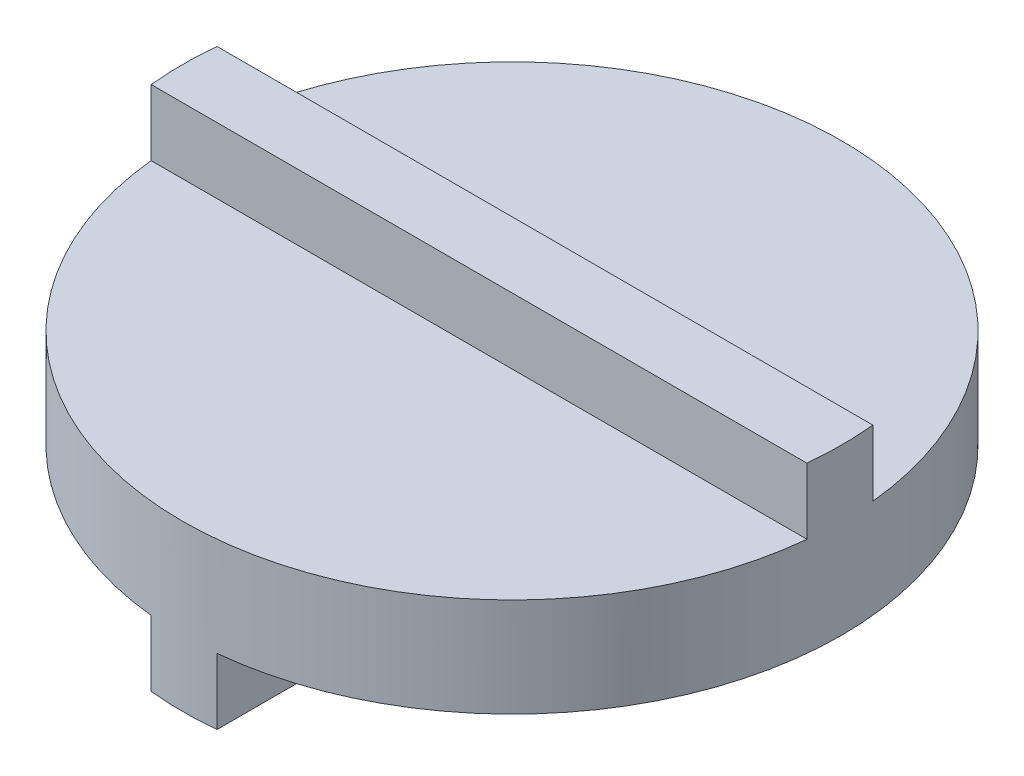
ISO-10303-21;
HEADER;
FILE_DESCRIPTION(('STEP AP214'),'2;1');
FILE_NAME('part.step','',(''),(''),'','','');
FILE_SCHEMA(('AUTOMOTIVE_DESIGN { 1 0 10303 214 1 1 1 1 }'));
ENDSEC;
DATA;
#1=APPLICATION_CONTEXT('core data for automotive mechanical design processes');
#2=APPLICATION_PROTOCOL_DEFINITION('international standard','automotive_design',2000,#1);
#3=PRODUCT_CONTEXT('',#1,'mechanical');
#4=PRODUCT('Part','Part','',(#3));
#5=PRODUCT_RELATED_PRODUCT_CATEGORY('part','',(#4));
#6=PRODUCT_DEFINITION_FORMATION('','',#4);
#7=PRODUCT_DEFINITION_CONTEXT('part definition',#1,'design');
#8=PRODUCT_DEFINITION('design','',#6,#7);
#9=PRODUCT_DEFINITION_SHAPE('','',#8);
#10=(LENGTH_UNIT() NAMED_UNIT(*) SI_UNIT(.MILLI.,.METRE.));
#11=(NAMED_UNIT(*) PLANE_ANGLE_UNIT() SI_UNIT($,.RADIAN.));
#12=(NAMED_UNIT(*) SI_UNIT($,.STERADIAN.) SOLID_ANGLE_UNIT());
#13=UNCERTAINTY_MEASURE_WITH_UNIT(LENGTH_MEASURE(1.E-05),#10,'distance_accuracy_value','');
#14=(GEOMETRIC_REPRESENTATION_CONTEXT(3) GLOBAL_UNCERTAINTY_ASSIGNED_CONTEXT((#13)) GLOBAL_UNIT_ASSIGNED_CONTEXT((#10,
#11,#12)) REPRESENTATION_CONTEXT('',''));
#15=CARTESIAN_POINT('',(0.,0.,0.));
#16=DIRECTION('',(0.,0.,1.));
#17=DIRECTION('',(1.,0.,0.));
#18=AXIS2_PLACEMENT_3D('',#15,#16,#17);
#19=CARTESIAN_POINT('',(0.,0.,0.));
#20=DIRECTION('',(0.,1.,0.));
#21=DIRECTION('',(0.,0.,1.));
#22=AXIS2_PLACEMENT_3D('',#19,#20,#21);
#23=PLANE('',#22);
#24=DIRECTION('',(0.,0.,1.));
#25=VECTOR('',#24,1.);
#26=CARTESIAN_POINT('',(5.00000000000001,0.,0.));
#27=LINE('',#26,#25);
#28=CARTESIAN_POINT('',(4.99999999999984,0.,-49.749371855331));
#29=VERTEX_POINT('',#28);
#30=CARTESIAN_POINT('',(5.00000000000018,0.,49.749371855331));
#31=VERTEX_POINT('',#30);
#32=EDGE_CURVE('E64',#29,#31,#27,.T.);
#33=ORIENTED_EDGE('',*,*,#32,.F.);
#34=CARTESIAN_POINT('',(0.,0.,0.));
#35=DIRECTION('',(0.,1.,0.));
#36=DIRECTION('',(0.,0.,1.));
#37=AXIS2_PLACEMENT_3D('',#34,#35,#36);
#38=CIRCLE('',#37,50.);
#39=EDGE_CURVE('E45',#31,#29,#38,.T.);
#40=ORIENTED_EDGE('',*,*,#39,.F.);
#41=EDGE_LOOP('',(#33,#40));
#42=FACE_BOUND('',#41,.T.);
#43=ADVANCED_FACE('F41',(#42),#23,.F.);
#44=DIRECTION('',(0.,0.,-1.));
#45=VECTOR('',#44,1.);
#46=CARTESIAN_POINT('',(-4.99999999999999,0.,0.));
#47=LINE('',#46,#45);
#48=CARTESIAN_POINT('',(-4.99999999999982,0.,49.749371855331));
#49=VERTEX_POINT('',#48);
#50=CARTESIAN_POINT('',(-5.00000000000017,0.,-49.749371855331));
#51=VERTEX_POINT('',#50);
#52=EDGE_CURVE('E57',#49,#51,#47,.T.);
#53=ORIENTED_EDGE('',*,*,#52,.F.);
#54=EDGE_CURVE('E129',#51,#49,#38,.T.);
#55=ORIENTED_EDGE('',*,*,#54,.F.);
#56=EDGE_LOOP('',(#53,#55));
#57=FACE_BOUND('',#56,.T.);
#58=ADVANCED_FACE('F203',(#57),#23,.F.);
#59=CARTESIAN_POINT('',(0.,15.,0.));
#60=DIRECTION('',(0.,1.,0.));
#61=DIRECTION('',(0.,0.,1.));
#62=AXIS2_PLACEMENT_3D('',#59,#60,#61);
#63=PLANE('',#62);
#64=DIRECTION('',(-1.,0.,0.));
#65=VECTOR('',#64,1.);
#66=CARTESIAN_POINT('',(-49.749371855331,15.,-5.));
#67=LINE('',#66,#65);
#68=CARTESIAN_POINT('',(49.749371855331,15.,-5.));
#69=VERTEX_POINT('',#68);
#70=CARTESIAN_POINT('',(-49.749371855331,15.,-5.));
#71=VERTEX_POINT('',#70);
#72=EDGE_CURVE('E136',#69,#71,#67,.T.);
#73=ORIENTED_EDGE('',*,*,#72,.F.);
#74=CARTESIAN_POINT('',(0.,15.,0.));
#75=DIRECTION('',(0.,1.,0.));
#76=DIRECTION('',(0.,0.,1.));
#77=AXIS2_PLACEMENT_3D('',#74,#75,#76);
#78=CIRCLE('',#77,50.);
#79=EDGE_CURVE('E11',#69,#71,#78,.T.);
#80=ORIENTED_EDGE('',*,*,#79,.T.);
#81=EDGE_LOOP('',(#73,#80));
#82=FACE_BOUND('',#81,.T.);
#83=ADVANCED_FACE('F207',(#82),#63,.T.);
#84=CARTESIAN_POINT('',(0.,15.,0.));
#85=DIRECTION('',(0.,-1.,0.));
#86=DIRECTION('',(0.,0.,-1.));
#87=AXIS2_PLACEMENT_3D('',#84,#85,#86);
#88=CYLINDRICAL_SURFACE('',#87,50.);
#89=ORIENTED_EDGE('',*,*,#79,.F.);
#90=DIRECTION('',(0.,-1.,0.));
#91=VECTOR('',#90,1.);
#92=CARTESIAN_POINT('',(49.749371855331,25.,-5.));
#93=LINE('',#92,#91);
#94=CARTESIAN_POINT('',(49.749371855331,25.,-5.));
#95=VERTEX_POINT('',#94);
#96=EDGE_CURVE('E162',#95,#69,#93,.T.);
#97=ORIENTED_EDGE('',*,*,#96,.F.);
#98=CARTESIAN_POINT('',(0.,25.,0.));
#99=DIRECTION('',(0.,1.,0.));
#100=DIRECTION('',(0.,0.,1.));
#101=AXIS2_PLACEMENT_3D('',#98,#99,#100);
#102=CIRCLE('',#101,50.);
#103=CARTESIAN_POINT('',(49.749371855331,25.,5.));
#104=VERTEX_POINT('',#103);
#105=EDGE_CURVE('E149',#104,#95,#102,.T.);
#106=ORIENTED_EDGE('',*,*,#105,.F.);
#107=DIRECTION('',(0.,-1.,0.));
#108=VECTOR('',#107,1.);
#109=CARTESIAN_POINT('',(49.749371855331,25.,5.));
#110=LINE('',#109,#108);
#111=CARTESIAN_POINT('',(49.749371855331,15.,5.));
#112=VERTEX_POINT('',#111);
#113=EDGE_CURVE('E166',#104,#112,#110,.T.);
#114=ORIENTED_EDGE('',*,*,#113,.T.);
#115=CARTESIAN_POINT('',(-49.749371855331,15.,5.));
#116=VERTEX_POINT('',#115);
#117=EDGE_CURVE('E51',#116,#112,#78,.T.);
#118=ORIENTED_EDGE('',*,*,#117,.F.);
#119=DIRECTION('',(0.,-1.,0.));
#120=VECTOR('',#119,1.);
#121=CARTESIAN_POINT('',(-49.749371855331,25.,5.));
#122=LINE('',#121,#120);
#123=CARTESIAN_POINT('',(-49.749371855331,25.,5.));
#124=VERTEX_POINT('',#123);
#125=EDGE_CURVE('E170',#124,#116,#122,.T.);
#126=ORIENTED_EDGE('',*,*,#125,.F.);
#127=CARTESIAN_POINT('',(0.,25.,0.));
#128=DIRECTION('',(0.,1.,0.));
#129=DIRECTION('',(0.,0.,1.));
#130=AXIS2_PLACEMENT_3D('',#127,#128,#129);
#131=CIRCLE('',#130,50.);
#132=CARTESIAN_POINT('',(-49.749371855331,25.,-5.));
#133=VERTEX_POINT('',#132);
#134=EDGE_CURVE('E142',#133,#124,#131,.T.);
#135=ORIENTED_EDGE('',*,*,#134,.F.);
#136=DIRECTION('',(0.,-1.,0.));
#137=VECTOR('',#136,1.);
#138=CARTESIAN_POINT('',(-49.749371855331,25.,-5.));
#139=LINE('',#138,#137);
#140=EDGE_CURVE('E154',#133,#71,#139,.T.);
#141=ORIENTED_EDGE('',*,*,#140,.T.);
#142=EDGE_LOOP('',(#89,#97,#106,#114,#118,#126,#135,#141));
#143=FACE_BOUND('',#142,.T.);
#144=ORIENTED_EDGE('',*,*,#39,.T.);
#145=DIRECTION('',(0.,1.,0.));
#146=VECTOR('',#145,1.);
#147=CARTESIAN_POINT('',(4.99999999999984,-10.,-49.749371855331));
#148=LINE('',#147,#146);
#149=CARTESIAN_POINT('',(4.99999999999984,-10.,-49.749371855331));
#150=VERTEX_POINT('',#149);
#151=EDGE_CURVE('E138',#150,#29,#148,.T.);
#152=ORIENTED_EDGE('',*,*,#151,.F.);
#153=CARTESIAN_POINT('',(0.,-10.,0.));
#154=DIRECTION('',(0.,-1.,0.));
#155=DIRECTION('',(0.,0.,-1.));
#156=AXIS2_PLACEMENT_3D('',#153,#154,#155);
#157=CIRCLE('',#156,50.);
#158=CARTESIAN_POINT('',(-5.00000000000017,-10.,-49.749371855331));
#159=VERTEX_POINT('',#158);
#160=EDGE_CURVE('E117',#159,#150,#157,.T.);
#161=ORIENTED_EDGE('',*,*,#160,.F.);
#162=DIRECTION('',(0.,1.,0.));
#163=VECTOR('',#162,1.);
#164=CARTESIAN_POINT('',(-5.00000000000017,-10.,-49.749371855331));
#165=LINE('',#164,#163);
#166=EDGE_CURVE('E113',#159,#51,#165,.T.);
#167=ORIENTED_EDGE('',*,*,#166,.T.);
#168=ORIENTED_EDGE('',*,*,#54,.T.);
#169=DIRECTION('',(0.,1.,0.));
#170=VECTOR('',#169,1.);
#171=CARTESIAN_POINT('',(-4.99999999999982,-10.,49.749371855331));
#172=LINE('',#171,#170);
#173=CARTESIAN_POINT('',(-4.99999999999982,-10.,49.749371855331));
#174=VERTEX_POINT('',#173);
#175=EDGE_CURVE('E111',#174,#49,#172,.T.);
#176=ORIENTED_EDGE('',*,*,#175,.F.);
#177=CARTESIAN_POINT('',(5.00000000000018,-10.,49.749371855331));
#178=VERTEX_POINT('',#177);
#179=EDGE_CURVE('E118',#178,#174,#157,.T.);
#180=ORIENTED_EDGE('',*,*,#179,.F.);
#181=DIRECTION('',(0.,1.,0.));
#182=VECTOR('',#181,1.);
#183=CARTESIAN_POINT('',(5.00000000000018,-10.,49.749371855331));
#184=LINE('',#183,#182);
#185=EDGE_CURVE('E180',#178,#31,#184,.T.);
#186=ORIENTED_EDGE('',*,*,#185,.T.);
#187=EDGE_LOOP('',(#144,#152,#161,#167,#168,#176,#180,#186));
#188=FACE_BOUND('',#187,.T.);
#189=ADVANCED_FACE('F43',(#143,#188),#88,.T.);
#190=DIRECTION('',(1.,0.,0.));
#191=VECTOR('',#190,1.);
#192=CARTESIAN_POINT('',(-49.749371855331,15.,5.));
#193=LINE('',#192,#191);
#194=EDGE_CURVE('E131',#116,#112,#193,.T.);
#195=ORIENTED_EDGE('',*,*,#194,.F.);
#196=ORIENTED_EDGE('',*,*,#117,.T.);
#197=EDGE_LOOP('',(#195,#196));
#198=FACE_BOUND('',#197,.T.);
#199=ADVANCED_FACE('F209',(#198),#63,.T.);
#200=CARTESIAN_POINT('',(-49.749371855331,25.,5.));
#201=DIRECTION('',(0.,0.,-1.));
#202=DIRECTION('',(-1.,0.,0.));
#203=AXIS2_PLACEMENT_3D('',#200,#201,#202);
#204=PLANE('',#203);
#205=ORIENTED_EDGE('',*,*,#194,.T.);
#206=ORIENTED_EDGE('',*,*,#113,.F.);
#207=DIRECTION('',(1.,0.,0.));
#208=VECTOR('',#207,1.);
#209=CARTESIAN_POINT('',(-49.749371855331,25.,5.));
#210=LINE('',#209,#208);
#211=EDGE_CURVE('E146',#124,#104,#210,.T.);
#212=ORIENTED_EDGE('',*,*,#211,.F.);
#213=ORIENTED_EDGE('',*,*,#125,.T.);
#214=EDGE_LOOP('',(#205,#206,#212,#213));
#215=FACE_BOUND('',#214,.T.);
#216=ADVANCED_FACE('F212',(#215),#204,.F.);
#217=CARTESIAN_POINT('',(-49.749371855331,25.,-5.));
#218=DIRECTION('',(0.,0.,1.));
#219=DIRECTION('',(1.,0.,0.));
#220=AXIS2_PLACEMENT_3D('',#217,#218,#219);
#221=PLANE('',#220);
#222=ORIENTED_EDGE('',*,*,#72,.T.);
#223=ORIENTED_EDGE('',*,*,#140,.F.);
#224=DIRECTION('',(-1.,0.,0.));
#225=VECTOR('',#224,1.);
#226=CARTESIAN_POINT('',(-49.749371855331,25.,-5.));
#227=LINE('',#226,#225);
#228=EDGE_CURVE('E152',#95,#133,#227,.T.);
#229=ORIENTED_EDGE('',*,*,#228,.F.);
#230=ORIENTED_EDGE('',*,*,#96,.T.);
#231=EDGE_LOOP('',(#222,#223,#229,#230));
#232=FACE_BOUND('',#231,.T.);
#233=ADVANCED_FACE('F215',(#232),#221,.F.);
#234=CARTESIAN_POINT('',(0.,25.,0.));
#235=DIRECTION('',(0.,1.,0.));
#236=DIRECTION('',(0.,0.,1.));
#237=AXIS2_PLACEMENT_3D('',#234,#235,#236);
#238=PLANE('',#237);
#239=ORIENTED_EDGE('',*,*,#134,.T.);
#240=ORIENTED_EDGE('',*,*,#211,.T.);
#241=ORIENTED_EDGE('',*,*,#105,.T.);
#242=ORIENTED_EDGE('',*,*,#228,.T.);
#243=EDGE_LOOP('',(#239,#240,#241,#242));
#244=FACE_BOUND('',#243,.T.);
#245=ADVANCED_FACE('F200',(#244),#238,.T.);
#246=CARTESIAN_POINT('',(-4.99999999999999,-10.,0.));
#247=DIRECTION('',(1.,0.,0.));
#248=DIRECTION('',(0.,0.,-1.));
#249=AXIS2_PLACEMENT_3D('',#246,#247,#248);
#250=PLANE('',#249);
#251=ORIENTED_EDGE('',*,*,#52,.T.);
#252=ORIENTED_EDGE('',*,*,#166,.F.);
#253=DIRECTION('',(0.,0.,-1.));
#254=VECTOR('',#253,1.);
#255=CARTESIAN_POINT('',(-4.99999999999999,-10.,0.));
#256=LINE('',#255,#254);
#257=EDGE_CURVE('E107',#174,#159,#256,.T.);
#258=ORIENTED_EDGE('',*,*,#257,.F.);
#259=ORIENTED_EDGE('',*,*,#175,.T.);
#260=EDGE_LOOP('',(#251,#252,#258,#259));
#261=FACE_BOUND('',#260,.T.);
#262=ADVANCED_FACE('F109',(#261),#250,.F.);
#263=CARTESIAN_POINT('',(5.00000000000001,-10.,0.));
#264=DIRECTION('',(-1.,0.,0.));
#265=DIRECTION('',(0.,0.,1.));
#266=AXIS2_PLACEMENT_3D('',#263,#264,#265);
#267=PLANE('',#266);
#268=ORIENTED_EDGE('',*,*,#32,.T.);
#269=ORIENTED_EDGE('',*,*,#185,.F.);
#270=DIRECTION('',(0.,0.,1.));
#271=VECTOR('',#270,1.);
#272=CARTESIAN_POINT('',(5.00000000000001,-10.,0.));
#273=LINE('',#272,#271);
#274=EDGE_CURVE('E123',#150,#178,#273,.T.);
#275=ORIENTED_EDGE('',*,*,#274,.F.);
#276=ORIENTED_EDGE('',*,*,#151,.T.);
#277=EDGE_LOOP('',(#268,#269,#275,#276));
#278=FACE_BOUND('',#277,.T.);
#279=ADVANCED_FACE('F182',(#278),#267,.F.);
#280=CARTESIAN_POINT('',(0.,-10.,0.));
#281=DIRECTION('',(0.,-1.,0.));
#282=DIRECTION('',(0.,0.,-1.));
#283=AXIS2_PLACEMENT_3D('',#280,#281,#282);
#284=PLANE('',#283);
#285=ORIENTED_EDGE('',*,*,#179,.T.);
#286=ORIENTED_EDGE('',*,*,#257,.T.);
#287=ORIENTED_EDGE('',*,*,#160,.T.);
#288=ORIENTED_EDGE('',*,*,#274,.T.);
#289=EDGE_LOOP('',(#285,#286,#287,#288));
#290=FACE_BOUND('',#289,.T.);
#291=ADVANCED_FACE('F121',(#290),#284,.T.);
#292=CLOSED_SHELL('',(#43,#58,#83,#189,#199,#216,#233,#245,#262,#279,#291));
#293=MANIFOLD_SOLID_BREP('B2',#292);
#294=ADVANCED_BREP_SHAPE_REPRESENTATION('',(#18,#293),#14);
#295=SHAPE_DEFINITION_REPRESENTATION(#9,#294);
ENDSEC;
END-ISO-10303-21;
